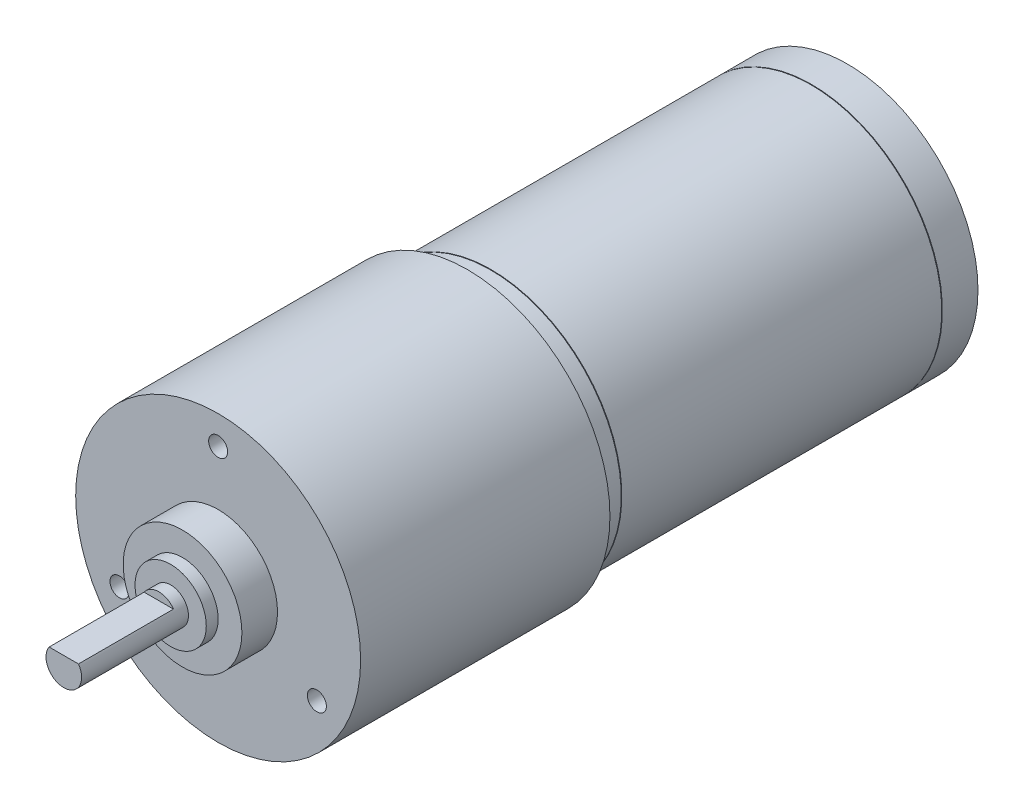
ISO-10303-21;
HEADER;
FILE_DESCRIPTION(('STEP AP214'),'2;1');
FILE_NAME('part.step','',(''),(''),'','','');
FILE_SCHEMA(('AUTOMOTIVE_DESIGN { 1 0 10303 214 1 1 1 1 }'));
ENDSEC;
DATA;
#1=APPLICATION_CONTEXT('core data for automotive mechanical design processes');
#2=APPLICATION_PROTOCOL_DEFINITION('international standard','automotive_design',2000,#1);
#3=PRODUCT_CONTEXT('',#1,'mechanical');
#4=PRODUCT('Part','Part','',(#3));
#5=PRODUCT_RELATED_PRODUCT_CATEGORY('part','',(#4));
#6=PRODUCT_DEFINITION_FORMATION('','',#4);
#7=PRODUCT_DEFINITION_CONTEXT('part definition',#1,'design');
#8=PRODUCT_DEFINITION('design','',#6,#7);
#9=PRODUCT_DEFINITION_SHAPE('','',#8);
#10=(LENGTH_UNIT() NAMED_UNIT(*) SI_UNIT(.MILLI.,.METRE.));
#11=(NAMED_UNIT(*) PLANE_ANGLE_UNIT() SI_UNIT($,.RADIAN.));
#12=(NAMED_UNIT(*) SI_UNIT($,.STERADIAN.) SOLID_ANGLE_UNIT());
#13=UNCERTAINTY_MEASURE_WITH_UNIT(LENGTH_MEASURE(1.E-05),#10,'distance_accuracy_value','');
#14=(GEOMETRIC_REPRESENTATION_CONTEXT(3) GLOBAL_UNCERTAINTY_ASSIGNED_CONTEXT((#13)) GLOBAL_UNIT_ASSIGNED_CONTEXT((#10,
#11,#12)) REPRESENTATION_CONTEXT('',''));
#15=CARTESIAN_POINT('',(0.,0.,0.));
#16=DIRECTION('',(0.,0.,1.));
#17=DIRECTION('',(1.,0.,0.));
#18=AXIS2_PLACEMENT_3D('',#15,#16,#17);
#19=CARTESIAN_POINT('',(0.,0.,57.));
#20=DIRECTION('',(0.,0.,1.));
#21=DIRECTION('',(1.,0.,0.));
#22=AXIS2_PLACEMENT_3D('',#19,#20,#21);
#23=PLANE('',#22);
#24=CARTESIAN_POINT('',(0.,0.,57.));
#25=DIRECTION('',(0.,0.,1.));
#26=DIRECTION('',(1.,0.,0.));
#27=AXIS2_PLACEMENT_3D('',#24,#25,#26);
#28=CIRCLE('',#27,3.);
#29=CARTESIAN_POINT('',(3.,0.,57.));
#30=VERTEX_POINT('',#29);
#31=EDGE_CURVE('E117',#30,#30,#28,.T.);
#32=ORIENTED_EDGE('',*,*,#31,.T.);
#33=EDGE_LOOP('',(#32));
#34=FACE_BOUND('',#33,.T.);
#35=CARTESIAN_POINT('',(0.,0.,57.));
#36=DIRECTION('',(0.,0.,1.));
#37=DIRECTION('',(1.,0.,0.));
#38=AXIS2_PLACEMENT_3D('',#35,#36,#37);
#39=CIRCLE('',#38,1.5);
#40=CARTESIAN_POINT('',(1.5,0.,57.));
#41=VERTEX_POINT('',#40);
#42=EDGE_CURVE('E116',#41,#41,#39,.F.);
#43=ORIENTED_EDGE('',*,*,#42,.T.);
#44=EDGE_LOOP('',(#43));
#45=FACE_BOUND('',#44,.T.);
#46=ADVANCED_FACE('F39',(#34,#45),#23,.T.);
#47=CARTESIAN_POINT('',(0.,0.,56.));
#48=DIRECTION('',(0.,0.,1.));
#49=DIRECTION('',(1.,0.,0.));
#50=AXIS2_PLACEMENT_3D('',#47,#48,#49);
#51=PLANE('',#50);
#52=CARTESIAN_POINT('',(0.,0.,56.));
#53=DIRECTION('',(0.,0.,1.));
#54=DIRECTION('',(1.,0.,0.));
#55=AXIS2_PLACEMENT_3D('',#52,#53,#54);
#56=CIRCLE('',#55,5.);
#57=CARTESIAN_POINT('',(5.,0.,56.));
#58=VERTEX_POINT('',#57);
#59=EDGE_CURVE('E121',#58,#58,#56,.T.);
#60=ORIENTED_EDGE('',*,*,#59,.T.);
#61=EDGE_LOOP('',(#60));
#62=FACE_BOUND('',#61,.T.);
#63=CARTESIAN_POINT('',(0.,0.,56.));
#64=DIRECTION('',(0.,0.,1.));
#65=DIRECTION('',(1.,0.,0.));
#66=AXIS2_PLACEMENT_3D('',#63,#64,#65);
#67=CIRCLE('',#66,3.);
#68=CARTESIAN_POINT('',(3.,0.,56.));
#69=VERTEX_POINT('',#68);
#70=EDGE_CURVE('E120',#69,#69,#67,.F.);
#71=ORIENTED_EDGE('',*,*,#70,.T.);
#72=EDGE_LOOP('',(#71));
#73=FACE_BOUND('',#72,.T.);
#74=ADVANCED_FACE('F199',(#62,#73),#51,.T.);
#75=CARTESIAN_POINT('',(0.,0.,53.));
#76=DIRECTION('',(0.,0.,1.));
#77=DIRECTION('',(1.,0.,0.));
#78=AXIS2_PLACEMENT_3D('',#75,#76,#77);
#79=PLANE('',#78);
#80=CARTESIAN_POINT('',(0.,9.6,53.));
#81=DIRECTION('',(0.,0.,1.));
#82=DIRECTION('',(1.,0.,0.));
#83=AXIS2_PLACEMENT_3D('',#80,#81,#82);
#84=CIRCLE('',#83,0.79999999999999);
#85=CARTESIAN_POINT('',(0.79999999999999,9.6,53.));
#86=VERTEX_POINT('',#85);
#87=EDGE_CURVE('E90',#86,#86,#84,.T.);
#88=ORIENTED_EDGE('',*,*,#87,.F.);
#89=EDGE_LOOP('',(#88));
#90=FACE_BOUND('',#89,.T.);
#91=CARTESIAN_POINT('',(8.31384387633122,-4.79999999999964,53.));
#92=DIRECTION('',(0.,0.,1.));
#93=DIRECTION('',(1.,0.,0.));
#94=AXIS2_PLACEMENT_3D('',#91,#92,#93);
#95=CIRCLE('',#94,0.79999999999999);
#96=CARTESIAN_POINT('',(9.11384387633121,-4.79999999999964,53.));
#97=VERTEX_POINT('',#96);
#98=EDGE_CURVE('E89',#97,#97,#95,.T.);
#99=ORIENTED_EDGE('',*,*,#98,.F.);
#100=EDGE_LOOP('',(#99));
#101=FACE_BOUND('',#100,.T.);
#102=CARTESIAN_POINT('',(-8.31384387633,-4.80000000000035,53.));
#103=DIRECTION('',(0.,0.,1.));
#104=DIRECTION('',(1.,0.,0.));
#105=AXIS2_PLACEMENT_3D('',#102,#103,#104);
#106=CIRCLE('',#105,0.79999999999999);
#107=CARTESIAN_POINT('',(-7.51384387633001,-4.80000000000035,53.));
#108=VERTEX_POINT('',#107);
#109=EDGE_CURVE('E100',#108,#108,#106,.T.);
#110=ORIENTED_EDGE('',*,*,#109,.F.);
#111=EDGE_LOOP('',(#110));
#112=FACE_BOUND('',#111,.T.);
#113=CARTESIAN_POINT('',(0.,0.,53.));
#114=DIRECTION('',(0.,0.,1.));
#115=DIRECTION('',(1.,0.,0.));
#116=AXIS2_PLACEMENT_3D('',#113,#114,#115);
#117=CIRCLE('',#116,12.);
#118=CARTESIAN_POINT('',(-12.,0.,53.));
#119=VERTEX_POINT('',#118);
#120=EDGE_CURVE('E128',#119,#119,#117,.T.);
#121=ORIENTED_EDGE('',*,*,#120,.T.);
#122=EDGE_LOOP('',(#121));
#123=FACE_BOUND('',#122,.T.);
#124=CARTESIAN_POINT('',(0.,0.,53.));
#125=DIRECTION('',(0.,0.,1.));
#126=DIRECTION('',(1.,0.,0.));
#127=AXIS2_PLACEMENT_3D('',#124,#125,#126);
#128=CIRCLE('',#127,5.);
#129=CARTESIAN_POINT('',(5.,0.,53.));
#130=VERTEX_POINT('',#129);
#131=EDGE_CURVE('E125',#130,#130,#128,.T.);
#132=ORIENTED_EDGE('',*,*,#131,.F.);
#133=EDGE_LOOP('',(#132));
#134=FACE_BOUND('',#133,.T.);
#135=ADVANCED_FACE('F205',(#90,#101,#112,#123,#134),#79,.T.);
#136=CARTESIAN_POINT('',(0.,0.,32.));
#137=DIRECTION('',(0.,0.,-1.));
#138=DIRECTION('',(-1.,0.,0.));
#139=AXIS2_PLACEMENT_3D('',#136,#137,#138);
#140=CYLINDRICAL_SURFACE('',#139,11.);
#141=CARTESIAN_POINT('',(0.,0.,30.));
#142=DIRECTION('',(0.,0.,-1.));
#143=DIRECTION('',(-1.,0.,0.));
#144=AXIS2_PLACEMENT_3D('',#141,#142,#143);
#145=CIRCLE('',#144,11.);
#146=CARTESIAN_POINT('',(-11.,0.,30.));
#147=VERTEX_POINT('',#146);
#148=EDGE_CURVE('E143',#147,#147,#145,.T.);
#149=ORIENTED_EDGE('',*,*,#148,.T.);
#150=EDGE_LOOP('',(#149));
#151=FACE_BOUND('',#150,.T.);
#152=CARTESIAN_POINT('',(0.,0.,3.05));
#153=DIRECTION('',(0.,0.,-1.));
#154=DIRECTION('',(-1.,0.,0.));
#155=AXIS2_PLACEMENT_3D('',#152,#153,#154);
#156=CIRCLE('',#155,11.);
#157=CARTESIAN_POINT('',(-11.,0.,3.05));
#158=VERTEX_POINT('',#157);
#159=EDGE_CURVE('E158',#158,#158,#156,.T.);
#160=ORIENTED_EDGE('',*,*,#159,.F.);
#161=EDGE_LOOP('',(#160));
#162=FACE_BOUND('',#161,.T.);
#163=ADVANCED_FACE('F220',(#151,#162),#140,.T.);
#164=CARTESIAN_POINT('',(0.,0.,3.05));
#165=DIRECTION('',(0.,0.,-1.));
#166=DIRECTION('',(-1.,0.,0.));
#167=AXIS2_PLACEMENT_3D('',#164,#165,#166);
#168=PLANE('',#167);
#169=CARTESIAN_POINT('',(0.,0.,3.05));
#170=DIRECTION('',(0.,0.,-1.));
#171=DIRECTION('',(-1.,0.,0.));
#172=AXIS2_PLACEMENT_3D('',#169,#170,#171);
#173=CIRCLE('',#172,10.75);
#174=CARTESIAN_POINT('',(-10.75,0.,3.05));
#175=VERTEX_POINT('',#174);
#176=EDGE_CURVE('E146',#175,#175,#173,.T.);
#177=ORIENTED_EDGE('',*,*,#176,.F.);
#178=EDGE_LOOP('',(#177));
#179=FACE_BOUND('',#178,.T.);
#180=ORIENTED_EDGE('',*,*,#159,.T.);
#181=EDGE_LOOP('',(#180));
#182=FACE_BOUND('',#181,.T.);
#183=ADVANCED_FACE('F252',(#179,#182),#168,.T.);
#184=CARTESIAN_POINT('',(0.,0.,3.));
#185=DIRECTION('',(0.,0.,-1.));
#186=DIRECTION('',(-1.,0.,0.));
#187=AXIS2_PLACEMENT_3D('',#184,#185,#186);
#188=PLANE('',#187);
#189=CARTESIAN_POINT('',(0.,0.,3.));
#190=DIRECTION('',(0.,0.,-1.));
#191=DIRECTION('',(-1.,0.,0.));
#192=AXIS2_PLACEMENT_3D('',#189,#190,#191);
#193=CIRCLE('',#192,10.75);
#194=CARTESIAN_POINT('',(-10.75,0.,3.));
#195=VERTEX_POINT('',#194);
#196=EDGE_CURVE('E150',#195,#195,#193,.T.);
#197=ORIENTED_EDGE('',*,*,#196,.T.);
#198=EDGE_LOOP('',(#197));
#199=FACE_BOUND('',#198,.T.);
#200=CARTESIAN_POINT('',(0.,0.,3.));
#201=DIRECTION('',(0.,0.,-1.));
#202=DIRECTION('',(-1.,0.,0.));
#203=AXIS2_PLACEMENT_3D('',#200,#201,#202);
#204=CIRCLE('',#203,11.);
#205=CARTESIAN_POINT('',(-11.,0.,3.));
#206=VERTEX_POINT('',#205);
#207=EDGE_CURVE('E149',#206,#206,#204,.T.);
#208=ORIENTED_EDGE('',*,*,#207,.F.);
#209=EDGE_LOOP('',(#208));
#210=FACE_BOUND('',#209,.T.);
#211=ADVANCED_FACE('F250',(#199,#210),#188,.F.);
#212=CARTESIAN_POINT('',(0.,0.,3.05));
#213=DIRECTION('',(0.,0.,-1.));
#214=DIRECTION('',(-1.,0.,0.));
#215=AXIS2_PLACEMENT_3D('',#212,#213,#214);
#216=CYLINDRICAL_SURFACE('',#215,10.75);
#217=ORIENTED_EDGE('',*,*,#176,.T.);
#218=EDGE_LOOP('',(#217));
#219=FACE_BOUND('',#218,.T.);
#220=ORIENTED_EDGE('',*,*,#196,.F.);
#221=EDGE_LOOP('',(#220));
#222=FACE_BOUND('',#221,.T.);
#223=ADVANCED_FACE('F246',(#219,#222),#216,.T.);
#224=CARTESIAN_POINT('',(0.,0.,0.));
#225=DIRECTION('',(0.,0.,1.));
#226=DIRECTION('',(1.,0.,0.));
#227=AXIS2_PLACEMENT_3D('',#224,#225,#226);
#228=PLANE('',#227);
#229=CARTESIAN_POINT('',(0.,0.,0.));
#230=DIRECTION('',(0.,0.,1.));
#231=DIRECTION('',(1.,0.,0.));
#232=AXIS2_PLACEMENT_3D('',#229,#230,#231);
#233=CIRCLE('',#232,11.);
#234=CARTESIAN_POINT('',(11.,0.,0.));
#235=VERTEX_POINT('',#234);
#236=EDGE_CURVE('E161',#235,#235,#233,.T.);
#237=ORIENTED_EDGE('',*,*,#236,.F.);
#238=EDGE_LOOP('',(#237));
#239=FACE_BOUND('',#238,.T.);
#240=ADVANCED_FACE('F249',(#239),#228,.F.);
#241=ORIENTED_EDGE('',*,*,#207,.T.);
#242=EDGE_LOOP('',(#241));
#243=FACE_BOUND('',#242,.T.);
#244=ORIENTED_EDGE('',*,*,#236,.T.);
#245=EDGE_LOOP('',(#244));
#246=FACE_BOUND('',#245,.T.);
#247=ADVANCED_FACE('F41',(#243,#246),#140,.T.);
#248=CARTESIAN_POINT('',(0.,0.,30.05));
#249=DIRECTION('',(0.,0.,-1.));
#250=DIRECTION('',(-1.,0.,0.));
#251=AXIS2_PLACEMENT_3D('',#248,#249,#250);
#252=PLANE('',#251);
#253=CARTESIAN_POINT('',(0.,0.,30.05));
#254=DIRECTION('',(0.,0.,-1.));
#255=DIRECTION('',(-1.,0.,0.));
#256=AXIS2_PLACEMENT_3D('',#253,#254,#255);
#257=CIRCLE('',#256,10.75);
#258=CARTESIAN_POINT('',(-10.75,0.,30.05));
#259=VERTEX_POINT('',#258);
#260=EDGE_CURVE('E140',#259,#259,#257,.T.);
#261=ORIENTED_EDGE('',*,*,#260,.F.);
#262=EDGE_LOOP('',(#261));
#263=FACE_BOUND('',#262,.T.);
#264=CARTESIAN_POINT('',(0.,0.,30.05));
#265=DIRECTION('',(0.,0.,-1.));
#266=DIRECTION('',(-1.,0.,0.));
#267=AXIS2_PLACEMENT_3D('',#264,#265,#266);
#268=CIRCLE('',#267,11.);
#269=CARTESIAN_POINT('',(-11.,0.,30.05));
#270=VERTEX_POINT('',#269);
#271=EDGE_CURVE('E153',#270,#270,#268,.T.);
#272=ORIENTED_EDGE('',*,*,#271,.T.);
#273=EDGE_LOOP('',(#272));
#274=FACE_BOUND('',#273,.T.);
#275=ADVANCED_FACE('F239',(#263,#274),#252,.T.);
#276=CARTESIAN_POINT('',(0.,0.,30.));
#277=DIRECTION('',(0.,0.,-1.));
#278=DIRECTION('',(-1.,0.,0.));
#279=AXIS2_PLACEMENT_3D('',#276,#277,#278);
#280=PLANE('',#279);
#281=CARTESIAN_POINT('',(0.,0.,30.));
#282=DIRECTION('',(0.,0.,-1.));
#283=DIRECTION('',(-1.,0.,0.));
#284=AXIS2_PLACEMENT_3D('',#281,#282,#283);
#285=CIRCLE('',#284,10.75);
#286=CARTESIAN_POINT('',(-10.75,0.,30.));
#287=VERTEX_POINT('',#286);
#288=EDGE_CURVE('E139',#287,#287,#285,.T.);
#289=ORIENTED_EDGE('',*,*,#288,.T.);
#290=EDGE_LOOP('',(#289));
#291=FACE_BOUND('',#290,.T.);
#292=ORIENTED_EDGE('',*,*,#148,.F.);
#293=EDGE_LOOP('',(#292));
#294=FACE_BOUND('',#293,.T.);
#295=ADVANCED_FACE('F237',(#291,#294),#280,.F.);
#296=CARTESIAN_POINT('',(0.,0.,30.05));
#297=DIRECTION('',(0.,0.,-1.));
#298=DIRECTION('',(-1.,0.,0.));
#299=AXIS2_PLACEMENT_3D('',#296,#297,#298);
#300=CYLINDRICAL_SURFACE('',#299,10.75);
#301=ORIENTED_EDGE('',*,*,#260,.T.);
#302=EDGE_LOOP('',(#301));
#303=FACE_BOUND('',#302,.T.);
#304=ORIENTED_EDGE('',*,*,#288,.F.);
#305=EDGE_LOOP('',(#304));
#306=FACE_BOUND('',#305,.T.);
#307=ADVANCED_FACE('F234',(#303,#306),#300,.T.);
#308=CARTESIAN_POINT('',(0.,0.,32.));
#309=DIRECTION('',(0.,0.,1.));
#310=DIRECTION('',(1.,0.,0.));
#311=AXIS2_PLACEMENT_3D('',#308,#309,#310);
#312=CIRCLE('',#311,11.);
#313=CARTESIAN_POINT('',(11.,0.,32.));
#314=VERTEX_POINT('',#313);
#315=EDGE_CURVE('E162',#314,#314,#312,.T.);
#316=ORIENTED_EDGE('',*,*,#315,.F.);
#317=EDGE_LOOP('',(#316));
#318=FACE_BOUND('',#317,.T.);
#319=ORIENTED_EDGE('',*,*,#271,.F.);
#320=EDGE_LOOP('',(#319));
#321=FACE_BOUND('',#320,.T.);
#322=ADVANCED_FACE('F232',(#318,#321),#140,.T.);
#323=CARTESIAN_POINT('',(0.,0.,53.));
#324=DIRECTION('',(0.,0.,-1.));
#325=DIRECTION('',(-1.,0.,0.));
#326=AXIS2_PLACEMENT_3D('',#323,#324,#325);
#327=CYLINDRICAL_SURFACE('',#326,12.);
#328=CARTESIAN_POINT('',(0.,0.,32.));
#329=DIRECTION('',(0.,0.,1.));
#330=DIRECTION('',(1.,0.,0.));
#331=AXIS2_PLACEMENT_3D('',#328,#329,#330);
#332=CIRCLE('',#331,12.);
#333=CARTESIAN_POINT('',(-12.,0.,32.));
#334=VERTEX_POINT('',#333);
#335=EDGE_CURVE('E124',#334,#334,#332,.T.);
#336=CARTESIAN_POINT('',(-12.,0.,53.));
#337=CARTESIAN_POINT('',(-12.,0.,52.78125));
#338=CARTESIAN_POINT('',(-12.,0.,52.5625));
#339=CARTESIAN_POINT('',(-12.,0.,52.125));
#340=CARTESIAN_POINT('',(-12.,0.,51.90625));
#341=CARTESIAN_POINT('',(-12.,0.,51.46875));
#342=CARTESIAN_POINT('',(-12.,0.,51.25));
#343=CARTESIAN_POINT('',(-12.,0.,50.8125));
#344=CARTESIAN_POINT('',(-12.,0.,50.59375));
#345=CARTESIAN_POINT('',(-12.,0.,50.15625));
#346=CARTESIAN_POINT('',(-12.,0.,49.9375));
#347=CARTESIAN_POINT('',(-12.,0.,49.5));
#348=CARTESIAN_POINT('',(-12.,0.,49.28125));
#349=CARTESIAN_POINT('',(-12.,0.,48.84375));
#350=CARTESIAN_POINT('',(-12.,0.,48.625));
#351=CARTESIAN_POINT('',(-12.,0.,48.1875));
#352=CARTESIAN_POINT('',(-12.,0.,47.96875));
#353=CARTESIAN_POINT('',(-12.,0.,47.53125));
#354=CARTESIAN_POINT('',(-12.,0.,47.3125));
#355=CARTESIAN_POINT('',(-12.,0.,46.875));
#356=CARTESIAN_POINT('',(-12.,0.,46.65625));
#357=CARTESIAN_POINT('',(-12.,0.,46.21875));
#358=CARTESIAN_POINT('',(-12.,0.,46.));
#359=CARTESIAN_POINT('',(-12.,0.,45.5625));
#360=CARTESIAN_POINT('',(-12.,0.,45.34375));
#361=CARTESIAN_POINT('',(-12.,0.,44.90625));
#362=CARTESIAN_POINT('',(-12.,0.,44.6875));
#363=CARTESIAN_POINT('',(-12.,0.,44.25));
#364=CARTESIAN_POINT('',(-12.,0.,44.03125));
#365=CARTESIAN_POINT('',(-12.,0.,43.59375));
#366=CARTESIAN_POINT('',(-12.,0.,43.375));
#367=CARTESIAN_POINT('',(-12.,0.,42.9375));
#368=CARTESIAN_POINT('',(-12.,0.,42.71875));
#369=CARTESIAN_POINT('',(-12.,0.,42.28125));
#370=CARTESIAN_POINT('',(-12.,0.,42.0625));
#371=CARTESIAN_POINT('',(-12.,0.,41.625));
#372=CARTESIAN_POINT('',(-12.,0.,41.40625));
#373=CARTESIAN_POINT('',(-12.,0.,40.96875));
#374=CARTESIAN_POINT('',(-12.,0.,40.75));
#375=CARTESIAN_POINT('',(-12.,0.,40.3125));
#376=CARTESIAN_POINT('',(-12.,0.,40.09375));
#377=CARTESIAN_POINT('',(-12.,0.,39.65625));
#378=CARTESIAN_POINT('',(-12.,0.,39.4375));
#379=CARTESIAN_POINT('',(-12.,0.,39.));
#380=CARTESIAN_POINT('',(-12.,0.,38.78125));
#381=CARTESIAN_POINT('',(-12.,0.,38.34375));
#382=CARTESIAN_POINT('',(-12.,0.,38.125));
#383=CARTESIAN_POINT('',(-12.,0.,37.6875));
#384=CARTESIAN_POINT('',(-12.,0.,37.46875));
#385=CARTESIAN_POINT('',(-12.,0.,37.03125));
#386=CARTESIAN_POINT('',(-12.,0.,36.8125));
#387=CARTESIAN_POINT('',(-12.,0.,36.375));
#388=CARTESIAN_POINT('',(-12.,0.,36.15625));
#389=CARTESIAN_POINT('',(-12.,0.,35.71875));
#390=CARTESIAN_POINT('',(-12.,0.,35.5));
#391=CARTESIAN_POINT('',(-12.,0.,35.0625));
#392=CARTESIAN_POINT('',(-12.,0.,34.84375));
#393=CARTESIAN_POINT('',(-12.,0.,34.40625));
#394=CARTESIAN_POINT('',(-12.,0.,34.1875));
#395=CARTESIAN_POINT('',(-12.,0.,33.75));
#396=CARTESIAN_POINT('',(-12.,0.,33.53125));
#397=CARTESIAN_POINT('',(-12.,0.,33.09375));
#398=CARTESIAN_POINT('',(-12.,0.,32.875));
#399=CARTESIAN_POINT('',(-12.,0.,32.4375));
#400=CARTESIAN_POINT('',(-12.,0.,32.21875));
#401=CARTESIAN_POINT('',(-12.,0.,32.));
#402=B_SPLINE_CURVE_WITH_KNOTS('',3,(#336,#337,#338,#339,#340,#341,#342,#343,#344,#345,#346,
#347,#348,#349,#350,#351,#352,#353,#354,#355,#356,#357,#358,#359,#360,#361,#362,#363,#364,#365,
#366,#367,#368,#369,#370,#371,#372,#373,#374,#375,#376,#377,#378,#379,#380,#381,#382,#383,#384,
#385,#386,#387,#388,#389,#390,#391,#392,#393,#394,#395,#396,#397,#398,#399,#400,#401),
.UNSPECIFIED.,.F.,.F.,(4,2,2,2,2,2,2,2,2,2,2,2,2,2,2,2,2,2,2,2,2,2,2,2,2,2,2,2,2,2,2,2,4),(0.,
0.656250000000004,1.3125,1.96875000000001,2.625,3.28125000000001,3.9375,4.59375000000001,5.25,
5.90625,6.56250000000001,7.21875,7.87500000000001,8.53125,9.1875,9.84375000000001,10.5,11.15625,
11.8125,12.46875,13.125,13.78125,14.4375,15.09375,15.75,16.40625,17.0625,17.71875,18.375,
19.03125,19.6875,20.34375,21.),.UNSPECIFIED.);
#403=EDGE_CURVE('BSEAM229',#119,#334,#402,.T.);
#404=ORIENTED_EDGE('',*,*,#120,.F.);
#405=ORIENTED_EDGE('',*,*,#335,.T.);
#406=ORIENTED_EDGE('',*,*,#403,.T.);
#407=ORIENTED_EDGE('',*,*,#403,.F.);
#408=EDGE_LOOP('',(#404,#406,#405,#407));
#409=FACE_BOUND('',#408,.T.);
#410=ADVANCED_FACE('F229',(#409),#327,.T.);
#411=CARTESIAN_POINT('',(0.,0.,32.));
#412=DIRECTION('',(0.,0.,1.));
#413=DIRECTION('',(1.,0.,0.));
#414=AXIS2_PLACEMENT_3D('',#411,#412,#413);
#415=PLANE('',#414);
#416=ORIENTED_EDGE('',*,*,#335,.F.);
#417=EDGE_LOOP('',(#416));
#418=FACE_BOUND('',#417,.T.);
#419=ORIENTED_EDGE('',*,*,#315,.T.);
#420=EDGE_LOOP('',(#419));
#421=FACE_BOUND('',#420,.T.);
#422=ADVANCED_FACE('F216',(#418,#421),#415,.F.);
#423=CARTESIAN_POINT('',(0.,0.,56.));
#424=DIRECTION('',(0.,0.,-1.));
#425=DIRECTION('',(-1.,0.,0.));
#426=AXIS2_PLACEMENT_3D('',#423,#424,#425);
#427=CYLINDRICAL_SURFACE('',#426,5.);
#428=ORIENTED_EDGE('',*,*,#59,.F.);
#429=EDGE_LOOP('',(#428));
#430=FACE_BOUND('',#429,.T.);
#431=ORIENTED_EDGE('',*,*,#131,.T.);
#432=EDGE_LOOP('',(#431));
#433=FACE_BOUND('',#432,.T.);
#434=ADVANCED_FACE('F211',(#430,#433),#427,.T.);
#435=CARTESIAN_POINT('',(0.,0.,57.));
#436=DIRECTION('',(0.,0.,-1.));
#437=DIRECTION('',(-1.,0.,0.));
#438=AXIS2_PLACEMENT_3D('',#435,#436,#437);
#439=CYLINDRICAL_SURFACE('',#438,3.);
#440=ORIENTED_EDGE('',*,*,#70,.F.);
#441=EDGE_LOOP('',(#440));
#442=FACE_BOUND('',#441,.T.);
#443=ORIENTED_EDGE('',*,*,#31,.F.);
#444=EDGE_LOOP('',(#443));
#445=FACE_BOUND('',#444,.T.);
#446=ADVANCED_FACE('F195',(#442,#445),#439,.T.);
#447=CARTESIAN_POINT('',(0.,0.,66.));
#448=DIRECTION('',(0.,0.,-1.));
#449=DIRECTION('',(-1.,0.,0.));
#450=AXIS2_PLACEMENT_3D('',#447,#448,#449);
#451=CYLINDRICAL_SURFACE('',#450,1.5);
#452=CARTESIAN_POINT('',(0.,0.,66.));
#453=DIRECTION('',(0.,0.,1.));
#454=DIRECTION('',(1.,0.,0.));
#455=AXIS2_PLACEMENT_3D('',#452,#453,#454);
#456=CIRCLE('',#455,1.5);
#457=CARTESIAN_POINT('',(-1.23592070943083,0.85,66.));
#458=VERTEX_POINT('',#457);
#459=CARTESIAN_POINT('',(1.23592070943083,0.85,66.));
#460=VERTEX_POINT('',#459);
#461=EDGE_CURVE('E113',#458,#460,#456,.T.);
#462=ORIENTED_EDGE('',*,*,#461,.F.);
#463=DIRECTION('',(0.,0.,-1.));
#464=VECTOR('',#463,1.);
#465=CARTESIAN_POINT('',(-1.23592070943083,0.85,66.));
#466=LINE('',#465,#464);
#467=CARTESIAN_POINT('',(-1.23592070943083,0.85,58.));
#468=VERTEX_POINT('',#467);
#469=EDGE_CURVE('E55',#458,#468,#466,.T.);
#470=ORIENTED_EDGE('',*,*,#469,.T.);
#471=CARTESIAN_POINT('',(0.,0.,58.));
#472=DIRECTION('',(0.,0.,1.));
#473=DIRECTION('',(1.,0.,0.));
#474=AXIS2_PLACEMENT_3D('',#471,#472,#473);
#475=CIRCLE('',#474,1.5);
#476=CARTESIAN_POINT('',(1.23592070943083,0.85,58.));
#477=VERTEX_POINT('',#476);
#478=EDGE_CURVE('E11',#477,#468,#475,.T.);
#479=ORIENTED_EDGE('',*,*,#478,.F.);
#480=DIRECTION('',(0.,0.,-1.));
#481=VECTOR('',#480,1.);
#482=CARTESIAN_POINT('',(1.23592070943083,0.85,66.));
#483=LINE('',#482,#481);
#484=EDGE_CURVE('E109',#477,#460,#483,.F.);
#485=ORIENTED_EDGE('',*,*,#484,.T.);
#486=EDGE_LOOP('',(#462,#470,#479,#485));
#487=FACE_BOUND('',#486,.T.);
#488=ORIENTED_EDGE('',*,*,#42,.F.);
#489=EDGE_LOOP('',(#488));
#490=FACE_BOUND('',#489,.T.);
#491=ADVANCED_FACE('F183',(#487,#490),#451,.T.);
#492=CARTESIAN_POINT('',(0.,0.,66.));
#493=DIRECTION('',(0.,0.,1.));
#494=DIRECTION('',(1.,0.,0.));
#495=AXIS2_PLACEMENT_3D('',#492,#493,#494);
#496=PLANE('',#495);
#497=DIRECTION('',(1.,0.,0.));
#498=VECTOR('',#497,1.);
#499=CARTESIAN_POINT('',(0.,0.85,66.));
#500=LINE('',#499,#498);
#501=EDGE_CURVE('E48',#458,#460,#500,.T.);
#502=ORIENTED_EDGE('',*,*,#501,.F.);
#503=ORIENTED_EDGE('',*,*,#461,.T.);
#504=EDGE_LOOP('',(#502,#503));
#505=FACE_BOUND('',#504,.T.);
#506=ADVANCED_FACE('F185',(#505),#496,.T.);
#507=CARTESIAN_POINT('',(0.,0.,58.));
#508=DIRECTION('',(0.,0.,1.));
#509=DIRECTION('',(1.,0.,0.));
#510=AXIS2_PLACEMENT_3D('',#507,#508,#509);
#511=PLANE('',#510);
#512=ORIENTED_EDGE('',*,*,#478,.T.);
#513=DIRECTION('',(1.,0.,0.));
#514=VECTOR('',#513,1.);
#515=CARTESIAN_POINT('',(-2.23710149978965,0.85,58.));
#516=LINE('',#515,#514);
#517=EDGE_CURVE('E106',#468,#477,#516,.T.);
#518=ORIENTED_EDGE('',*,*,#517,.T.);
#519=EDGE_LOOP('',(#512,#518));
#520=FACE_BOUND('',#519,.T.);
#521=ADVANCED_FACE('F187',(#520),#511,.T.);
#522=CARTESIAN_POINT('',(-2.23710149978965,0.85,58.));
#523=DIRECTION('',(0.,-1.,0.));
#524=DIRECTION('',(0.,0.,-1.));
#525=AXIS2_PLACEMENT_3D('',#522,#523,#524);
#526=PLANE('',#525);
#527=ORIENTED_EDGE('',*,*,#501,.T.);
#528=ORIENTED_EDGE('',*,*,#484,.F.);
#529=ORIENTED_EDGE('',*,*,#517,.F.);
#530=ORIENTED_EDGE('',*,*,#469,.F.);
#531=EDGE_LOOP('',(#527,#528,#529,#530));
#532=FACE_BOUND('',#531,.T.);
#533=ADVANCED_FACE('F178',(#532),#526,.F.);
#534=CARTESIAN_POINT('',(-8.31384387633,-4.80000000000035,47.8));
#535=DIRECTION('',(0.,0.,1.));
#536=DIRECTION('',(1.,0.,0.));
#537=AXIS2_PLACEMENT_3D('',#534,#535,#536);
#538=CONICAL_SURFACE('',#537,0.799999999999988,1.02974425867664);
#539=CARTESIAN_POINT('',(-8.31384387633,-4.80000000000035,47.319311504778));
#540=VERTEX_POINT('',#539);
#541=VERTEX_LOOP('',#540);
#542=FACE_BOUND('',#541,.T.);
#543=CARTESIAN_POINT('',(-8.31384387633,-4.80000000000035,47.8));
#544=DIRECTION('',(0.,0.,1.));
#545=DIRECTION('',(1.,0.,0.));
#546=AXIS2_PLACEMENT_3D('',#543,#544,#545);
#547=CIRCLE('',#546,0.799999999999988);
#548=CARTESIAN_POINT('',(-7.51384387633001,-4.80000000000035,47.8));
#549=VERTEX_POINT('',#548);
#550=EDGE_CURVE('E103',#549,#549,#547,.T.);
#551=ORIENTED_EDGE('',*,*,#550,.T.);
#552=EDGE_LOOP('',(#551));
#553=FACE_BOUND('',#552,.T.);
#554=ADVANCED_FACE('F425',(#542,#553),#538,.F.);
#555=CARTESIAN_POINT('',(-8.31384387633,-4.80000000000035,53.));
#556=DIRECTION('',(0.,0.,1.));
#557=DIRECTION('',(1.,0.,0.));
#558=AXIS2_PLACEMENT_3D('',#555,#556,#557);
#559=CYLINDRICAL_SURFACE('',#558,0.799999999999989);
#560=ORIENTED_EDGE('',*,*,#550,.F.);
#561=EDGE_LOOP('',(#560));
#562=FACE_BOUND('',#561,.T.);
#563=ORIENTED_EDGE('',*,*,#109,.T.);
#564=EDGE_LOOP('',(#563));
#565=FACE_BOUND('',#564,.T.);
#566=ADVANCED_FACE('F437',(#562,#565),#559,.F.);
#567=CARTESIAN_POINT('',(8.31384387633122,-4.79999999999964,47.8));
#568=DIRECTION('',(0.,0.,1.));
#569=DIRECTION('',(1.,0.,0.));
#570=AXIS2_PLACEMENT_3D('',#567,#568,#569);
#571=CONICAL_SURFACE('',#570,0.799999999999988,1.02974425867664);
#572=CARTESIAN_POINT('',(8.31384387633122,-4.79999999999964,47.319311504778));
#573=VERTEX_POINT('',#572);
#574=VERTEX_LOOP('',#573);
#575=FACE_BOUND('',#574,.T.);
#576=CARTESIAN_POINT('',(8.31384387633122,-4.79999999999964,47.8));
#577=DIRECTION('',(0.,0.,1.));
#578=DIRECTION('',(1.,0.,0.));
#579=AXIS2_PLACEMENT_3D('',#576,#577,#578);
#580=CIRCLE('',#579,0.799999999999988);
#581=CARTESIAN_POINT('',(9.11384387633121,-4.79999999999964,47.8));
#582=VERTEX_POINT('',#581);
#583=EDGE_CURVE('E93',#582,#582,#580,.T.);
#584=ORIENTED_EDGE('',*,*,#583,.T.);
#585=EDGE_LOOP('',(#584));
#586=FACE_BOUND('',#585,.T.);
#587=ADVANCED_FACE('F447',(#575,#586),#571,.F.);
#588=CARTESIAN_POINT('',(8.31384387633122,-4.79999999999964,53.));
#589=DIRECTION('',(0.,0.,1.));
#590=DIRECTION('',(1.,0.,0.));
#591=AXIS2_PLACEMENT_3D('',#588,#589,#590);
#592=CYLINDRICAL_SURFACE('',#591,0.799999999999989);
#593=ORIENTED_EDGE('',*,*,#583,.F.);
#594=EDGE_LOOP('',(#593));
#595=FACE_BOUND('',#594,.T.);
#596=ORIENTED_EDGE('',*,*,#98,.T.);
#597=EDGE_LOOP('',(#596));
#598=FACE_BOUND('',#597,.T.);
#599=ADVANCED_FACE('F83',(#595,#598),#592,.F.);
#600=CARTESIAN_POINT('',(0.,9.6,47.8));
#601=DIRECTION('',(0.,0.,1.));
#602=DIRECTION('',(1.,0.,0.));
#603=AXIS2_PLACEMENT_3D('',#600,#601,#602);
#604=CONICAL_SURFACE('',#603,0.799999999999988,1.02974425867664);
#605=CARTESIAN_POINT('',(0.,9.6,47.319311504778));
#606=VERTEX_POINT('',#605);
#607=VERTEX_LOOP('',#606);
#608=FACE_BOUND('',#607,.T.);
#609=CARTESIAN_POINT('',(0.,9.6,47.8));
#610=DIRECTION('',(0.,0.,1.));
#611=DIRECTION('',(1.,0.,0.));
#612=AXIS2_PLACEMENT_3D('',#609,#610,#611);
#613=CIRCLE('',#612,0.799999999999988);
#614=CARTESIAN_POINT('',(0.799999999999988,9.6,47.8));
#615=VERTEX_POINT('',#614);
#616=EDGE_CURVE('E87',#615,#615,#613,.T.);
#617=ORIENTED_EDGE('',*,*,#616,.T.);
#618=EDGE_LOOP('',(#617));
#619=FACE_BOUND('',#618,.T.);
#620=ADVANCED_FACE('F79',(#608,#619),#604,.F.);
#621=CARTESIAN_POINT('',(0.,9.6,53.));
#622=DIRECTION('',(0.,0.,1.));
#623=DIRECTION('',(1.,0.,0.));
#624=AXIS2_PLACEMENT_3D('',#621,#622,#623);
#625=CYLINDRICAL_SURFACE('',#624,0.799999999999989);
#626=ORIENTED_EDGE('',*,*,#616,.F.);
#627=EDGE_LOOP('',(#626));
#628=FACE_BOUND('',#627,.T.);
#629=ORIENTED_EDGE('',*,*,#87,.T.);
#630=EDGE_LOOP('',(#629));
#631=FACE_BOUND('',#630,.T.);
#632=ADVANCED_FACE('F82',(#628,#631),#625,.F.);
#633=CLOSED_SHELL('',(#46,#74,#135,#163,#183,#211,#223,#240,#247,#275,#295,#307,#322,#410,#422,
#434,#446,#491,#506,#521,#533,#554,#566,#587,#599,#620,#632));
#634=CARTESIAN_POINT('',(0.,-8.5,26.8));
#635=DIRECTION('',(0.,0.,1.));
#636=DIRECTION('',(1.,0.,0.));
#637=AXIS2_PLACEMENT_3D('',#634,#635,#636);
#638=CONICAL_SURFACE('',#637,0.799999999999999,1.02974425867665);
#639=CARTESIAN_POINT('',(0.,-8.5,26.319311504778));
#640=VERTEX_POINT('',#639);
#641=VERTEX_LOOP('',#640);
#642=FACE_BOUND('',#641,.T.);
#643=CARTESIAN_POINT('',(0.,-8.5,26.8));
#644=DIRECTION('',(0.,0.,1.));
#645=DIRECTION('',(1.,0.,0.));
#646=AXIS2_PLACEMENT_3D('',#643,#644,#645);
#647=CIRCLE('',#646,0.799999999999999);
#648=CARTESIAN_POINT('',(0.799999999999999,-8.5,26.8));
#649=VERTEX_POINT('',#648);
#650=EDGE_CURVE('E157',#649,#649,#647,.T.);
#651=ORIENTED_EDGE('',*,*,#650,.T.);
#652=EDGE_LOOP('',(#651));
#653=FACE_BOUND('',#652,.T.);
#654=ADVANCED_FACE('F271',(#642,#653),#638,.F.);
#655=CARTESIAN_POINT('',(0.,-8.5,32.));
#656=DIRECTION('',(0.,0.,1.));
#657=DIRECTION('',(1.,0.,0.));
#658=AXIS2_PLACEMENT_3D('',#655,#656,#657);
#659=CYLINDRICAL_SURFACE('',#658,0.799999999999999);
#660=ORIENTED_EDGE('',*,*,#650,.F.);
#661=EDGE_LOOP('',(#660));
#662=FACE_BOUND('',#661,.T.);
#663=CARTESIAN_POINT('',(0.,-8.5,32.));
#664=DIRECTION('',(0.,0.,1.));
#665=DIRECTION('',(1.,0.,0.));
#666=AXIS2_PLACEMENT_3D('',#663,#664,#665);
#667=CIRCLE('',#666,0.799999999999999);
#668=CARTESIAN_POINT('',(0.799999999999999,-8.5,32.));
#669=VERTEX_POINT('',#668);
#670=EDGE_CURVE('E136',#669,#669,#667,.F.);
#671=ORIENTED_EDGE('',*,*,#670,.F.);
#672=EDGE_LOOP('',(#671));
#673=FACE_BOUND('',#672,.T.);
#674=ADVANCED_FACE('F225',(#662,#673),#659,.F.);
#675=ORIENTED_EDGE('',*,*,#670,.T.);
#676=EDGE_LOOP('',(#675));
#677=FACE_BOUND('',#676,.T.);
#678=ADVANCED_FACE('F222',(#677),#415,.F.);
#679=CLOSED_SHELL('',(#654,#674,#678));
#680=CARTESIAN_POINT('',(0.,8.5,26.8));
#681=DIRECTION('',(0.,0.,1.));
#682=DIRECTION('',(1.,0.,0.));
#683=AXIS2_PLACEMENT_3D('',#680,#681,#682);
#684=CONICAL_SURFACE('',#683,0.799999999999999,1.02974425867665);
#685=CARTESIAN_POINT('',(0.,8.5,26.319311504778));
#686=VERTEX_POINT('',#685);
#687=VERTEX_LOOP('',#686);
#688=FACE_BOUND('',#687,.T.);
#689=CARTESIAN_POINT('',(0.,8.5,26.8));
#690=DIRECTION('',(0.,0.,1.));
#691=DIRECTION('',(1.,0.,0.));
#692=AXIS2_PLACEMENT_3D('',#689,#690,#691);
#693=CIRCLE('',#692,0.799999999999999);
#694=CARTESIAN_POINT('',(0.799999999999999,8.5,26.8));
#695=VERTEX_POINT('',#694);
#696=EDGE_CURVE('E154',#695,#695,#693,.T.);
#697=ORIENTED_EDGE('',*,*,#696,.T.);
#698=EDGE_LOOP('',(#697));
#699=FACE_BOUND('',#698,.T.);
#700=ADVANCED_FACE('F262',(#688,#699),#684,.F.);
#701=CARTESIAN_POINT('',(0.,8.5,32.));
#702=DIRECTION('',(0.,0.,1.));
#703=DIRECTION('',(1.,0.,0.));
#704=AXIS2_PLACEMENT_3D('',#701,#702,#703);
#705=CYLINDRICAL_SURFACE('',#704,0.799999999999999);
#706=ORIENTED_EDGE('',*,*,#696,.F.);
#707=EDGE_LOOP('',(#706));
#708=FACE_BOUND('',#707,.T.);
#709=CARTESIAN_POINT('',(0.,8.5,32.));
#710=DIRECTION('',(0.,0.,1.));
#711=DIRECTION('',(1.,0.,0.));
#712=AXIS2_PLACEMENT_3D('',#709,#710,#711);
#713=CIRCLE('',#712,0.799999999999999);
#714=CARTESIAN_POINT('',(0.799999999999999,8.5,32.));
#715=VERTEX_POINT('',#714);
#716=EDGE_CURVE('E131',#715,#715,#713,.F.);
#717=ORIENTED_EDGE('',*,*,#716,.F.);
#718=EDGE_LOOP('',(#717));
#719=FACE_BOUND('',#718,.T.);
#720=ADVANCED_FACE('F259',(#708,#719),#705,.F.);
#721=ORIENTED_EDGE('',*,*,#716,.T.);
#722=EDGE_LOOP('',(#721));
#723=FACE_BOUND('',#722,.T.);
#724=ADVANCED_FACE('F227',(#723),#415,.F.);
#725=CLOSED_SHELL('',(#700,#720,#724));
#726=ORIENTED_CLOSED_SHELL('',*,#679,.T.);
#727=ORIENTED_CLOSED_SHELL('',*,#725,.T.);
#728=BREP_WITH_VOIDS('B2',#633,(#726,#727));
#729=ADVANCED_BREP_SHAPE_REPRESENTATION('',(#18,#728),#14);
#730=SHAPE_DEFINITION_REPRESENTATION(#9,#729);
ENDSEC;
END-ISO-10303-21;
